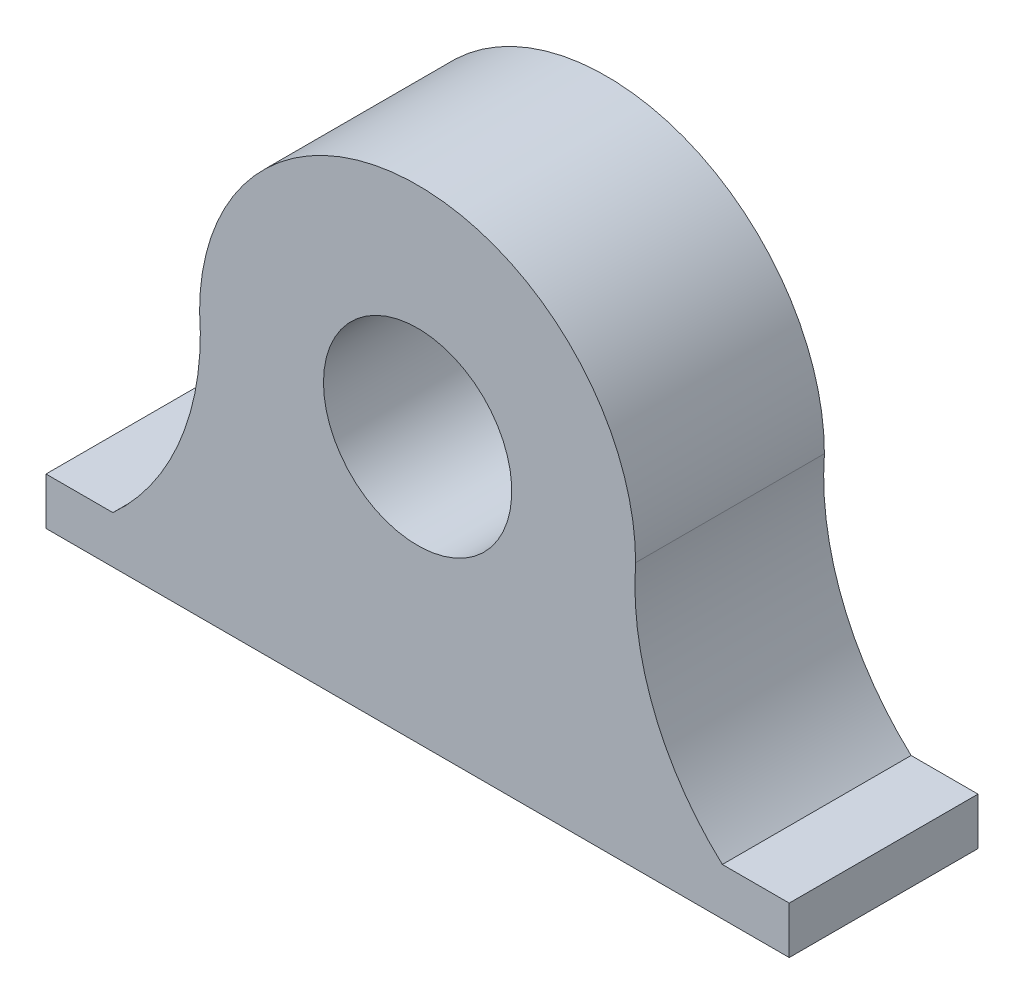
ISO-10303-21;
HEADER;
FILE_DESCRIPTION(('STEP AP214'),'2;1');
FILE_NAME('part.step','',(''),(''),'','','');
FILE_SCHEMA(('AUTOMOTIVE_DESIGN { 1 0 10303 214 1 1 1 1 }'));
ENDSEC;
DATA;
#1=APPLICATION_CONTEXT('core data for automotive mechanical design processes');
#2=APPLICATION_PROTOCOL_DEFINITION('international standard','automotive_design',2000,#1);
#3=PRODUCT_CONTEXT('',#1,'mechanical');
#4=PRODUCT('Part','Part','',(#3));
#5=PRODUCT_RELATED_PRODUCT_CATEGORY('part','',(#4));
#6=PRODUCT_DEFINITION_FORMATION('','',#4);
#7=PRODUCT_DEFINITION_CONTEXT('part definition',#1,'design');
#8=PRODUCT_DEFINITION('design','',#6,#7);
#9=PRODUCT_DEFINITION_SHAPE('','',#8);
#10=(LENGTH_UNIT() NAMED_UNIT(*) SI_UNIT(.MILLI.,.METRE.));
#11=(NAMED_UNIT(*) PLANE_ANGLE_UNIT() SI_UNIT($,.RADIAN.));
#12=(NAMED_UNIT(*) SI_UNIT($,.STERADIAN.) SOLID_ANGLE_UNIT());
#13=UNCERTAINTY_MEASURE_WITH_UNIT(LENGTH_MEASURE(1.E-05),#10,'distance_accuracy_value','');
#14=(GEOMETRIC_REPRESENTATION_CONTEXT(3) GLOBAL_UNCERTAINTY_ASSIGNED_CONTEXT((#13)) GLOBAL_UNIT_ASSIGNED_CONTEXT((#10,
#11,#12)) REPRESENTATION_CONTEXT('',''));
#15=CARTESIAN_POINT('',(0.,0.,0.));
#16=DIRECTION('',(0.,0.,1.));
#17=DIRECTION('',(1.,0.,0.));
#18=AXIS2_PLACEMENT_3D('',#15,#16,#17);
#19=CARTESIAN_POINT('',(0.,-44.0000000000001,38.1));
#20=DIRECTION('',(0.,1.,0.));
#21=DIRECTION('',(-1.,0.,0.));
#22=AXIS2_PLACEMENT_3D('',#19,#20,#21);
#23=PLANE('',#22);
#24=DIRECTION('',(1.,0.,0.));
#25=VECTOR('',#24,1.);
#26=CARTESIAN_POINT('',(0.,-44.0000000000001,0.));
#27=LINE('',#26,#25);
#28=CARTESIAN_POINT('',(61.5034248182107,-44.,0.));
#29=VERTEX_POINT('',#28);
#30=CARTESIAN_POINT('',(75.,-44.,0.));
#31=VERTEX_POINT('',#30);
#32=EDGE_CURVE('E166',#29,#31,#27,.T.);
#33=ORIENTED_EDGE('',*,*,#32,.F.);
#34=DIRECTION('',(0.,0.,-1.));
#35=VECTOR('',#34,1.);
#36=CARTESIAN_POINT('',(61.5034248182107,-44.,38.1));
#37=LINE('',#36,#35);
#38=CARTESIAN_POINT('',(61.5034248182107,-44.,38.1));
#39=VERTEX_POINT('',#38);
#40=EDGE_CURVE('E11',#39,#29,#37,.T.);
#41=ORIENTED_EDGE('',*,*,#40,.F.);
#42=DIRECTION('',(1.,0.,0.));
#43=VECTOR('',#42,1.);
#44=CARTESIAN_POINT('',(0.,-44.0000000000001,38.1));
#45=LINE('',#44,#43);
#46=CARTESIAN_POINT('',(75.,-44.,38.1));
#47=VERTEX_POINT('',#46);
#48=EDGE_CURVE('E236',#39,#47,#45,.T.);
#49=ORIENTED_EDGE('',*,*,#48,.T.);
#50=DIRECTION('',(0.,0.,-1.));
#51=VECTOR('',#50,1.);
#52=CARTESIAN_POINT('',(75.,-44.,38.1));
#53=LINE('',#52,#51);
#54=EDGE_CURVE('E59',#47,#31,#53,.T.);
#55=ORIENTED_EDGE('',*,*,#54,.T.);
#56=EDGE_LOOP('',(#33,#41,#49,#55));
#57=FACE_BOUND('',#56,.T.);
#58=ADVANCED_FACE('F41',(#57),#23,.T.);
#59=CARTESIAN_POINT('',(98.,-4.,38.1));
#60=DIRECTION('',(0.,0.,-1.));
#61=DIRECTION('',(-1.,0.,0.));
#62=AXIS2_PLACEMENT_3D('',#59,#60,#61);
#63=CYLINDRICAL_SURFACE('',#62,54.1479454827235);
#64=CARTESIAN_POINT('',(98.,-4.,0.));
#65=DIRECTION('',(0.,0.,1.));
#66=DIRECTION('',(1.,0.,0.));
#67=AXIS2_PLACEMENT_3D('',#64,#65,#66);
#68=CIRCLE('',#67,54.1479454827235);
#69=CARTESIAN_POINT('',(44.,0.,0.));
#70=VERTEX_POINT('',#69);
#71=EDGE_CURVE('E162',#29,#70,#68,.F.);
#72=ORIENTED_EDGE('',*,*,#71,.T.);
#73=DIRECTION('',(0.,0.,-1.));
#74=VECTOR('',#73,1.);
#75=CARTESIAN_POINT('',(44.,0.,38.1));
#76=LINE('',#75,#74);
#77=CARTESIAN_POINT('',(44.,0.,38.1));
#78=VERTEX_POINT('',#77);
#79=EDGE_CURVE('E51',#78,#70,#76,.T.);
#80=ORIENTED_EDGE('',*,*,#79,.F.);
#81=CARTESIAN_POINT('',(98.,-4.,38.1));
#82=DIRECTION('',(0.,0.,1.));
#83=DIRECTION('',(1.,0.,0.));
#84=AXIS2_PLACEMENT_3D('',#81,#82,#83);
#85=CIRCLE('',#84,54.1479454827235);
#86=EDGE_CURVE('E239',#39,#78,#85,.F.);
#87=ORIENTED_EDGE('',*,*,#86,.F.);
#88=ORIENTED_EDGE('',*,*,#40,.T.);
#89=EDGE_LOOP('',(#72,#80,#87,#88));
#90=FACE_BOUND('',#89,.T.);
#91=ADVANCED_FACE('F163',(#90),#63,.F.);
#92=CARTESIAN_POINT('',(0.,0.,38.1));
#93=DIRECTION('',(0.,0.,-1.));
#94=DIRECTION('',(-1.,0.,0.));
#95=AXIS2_PLACEMENT_3D('',#92,#93,#94);
#96=CYLINDRICAL_SURFACE('',#95,44.);
#97=CARTESIAN_POINT('',(0.,0.,0.));
#98=DIRECTION('',(0.,0.,1.));
#99=DIRECTION('',(1.,0.,0.));
#100=AXIS2_PLACEMENT_3D('',#97,#98,#99);
#101=CIRCLE('',#100,44.);
#102=CARTESIAN_POINT('',(-44.,0.,0.));
#103=VERTEX_POINT('',#102);
#104=EDGE_CURVE('E156',#70,#103,#101,.T.);
#105=ORIENTED_EDGE('',*,*,#104,.T.);
#106=DIRECTION('',(0.,0.,-1.));
#107=VECTOR('',#106,1.);
#108=CARTESIAN_POINT('',(-44.,0.,38.1));
#109=LINE('',#108,#107);
#110=CARTESIAN_POINT('',(-44.,0.,38.1));
#111=VERTEX_POINT('',#110);
#112=EDGE_CURVE('E146',#111,#103,#109,.T.);
#113=ORIENTED_EDGE('',*,*,#112,.F.);
#114=CARTESIAN_POINT('',(0.,0.,38.1));
#115=DIRECTION('',(0.,0.,1.));
#116=DIRECTION('',(1.,0.,0.));
#117=AXIS2_PLACEMENT_3D('',#114,#115,#116);
#118=CIRCLE('',#117,44.);
#119=EDGE_CURVE('E158',#78,#111,#118,.T.);
#120=ORIENTED_EDGE('',*,*,#119,.F.);
#121=ORIENTED_EDGE('',*,*,#79,.T.);
#122=EDGE_LOOP('',(#105,#113,#120,#121));
#123=FACE_BOUND('',#122,.T.);
#124=ADVANCED_FACE('F154',(#123),#96,.T.);
#125=CARTESIAN_POINT('',(-98.,-4.,38.1));
#126=DIRECTION('',(0.,0.,-1.));
#127=DIRECTION('',(-1.,0.,0.));
#128=AXIS2_PLACEMENT_3D('',#125,#126,#127);
#129=CYLINDRICAL_SURFACE('',#128,54.1479454827235);
#130=CARTESIAN_POINT('',(-98.,-4.,0.));
#131=DIRECTION('',(0.,0.,1.));
#132=DIRECTION('',(1.,0.,0.));
#133=AXIS2_PLACEMENT_3D('',#130,#131,#132);
#134=CIRCLE('',#133,54.1479454827235);
#135=CARTESIAN_POINT('',(-61.5034248182107,-44.,0.));
#136=VERTEX_POINT('',#135);
#137=EDGE_CURVE('E170',#136,#103,#134,.T.);
#138=ORIENTED_EDGE('',*,*,#137,.F.);
#139=DIRECTION('',(0.,0.,-1.));
#140=VECTOR('',#139,1.);
#141=CARTESIAN_POINT('',(-61.5034248182107,-44.,38.1));
#142=LINE('',#141,#140);
#143=CARTESIAN_POINT('',(-61.5034248182107,-44.,38.1));
#144=VERTEX_POINT('',#143);
#145=EDGE_CURVE('E139',#144,#136,#142,.T.);
#146=ORIENTED_EDGE('',*,*,#145,.F.);
#147=CARTESIAN_POINT('',(-98.,-4.,38.1));
#148=DIRECTION('',(0.,0.,1.));
#149=DIRECTION('',(1.,0.,0.));
#150=AXIS2_PLACEMENT_3D('',#147,#148,#149);
#151=CIRCLE('',#150,54.1479454827235);
#152=EDGE_CURVE('E246',#144,#111,#151,.T.);
#153=ORIENTED_EDGE('',*,*,#152,.T.);
#154=ORIENTED_EDGE('',*,*,#112,.T.);
#155=EDGE_LOOP('',(#138,#146,#153,#154));
#156=FACE_BOUND('',#155,.T.);
#157=ADVANCED_FACE('F218',(#156),#129,.F.);
#158=CARTESIAN_POINT('',(0.,-44.,38.1));
#159=DIRECTION('',(0.,1.,0.));
#160=DIRECTION('',(-1.,0.,0.));
#161=AXIS2_PLACEMENT_3D('',#158,#159,#160);
#162=PLANE('',#161);
#163=DIRECTION('',(1.,0.,0.));
#164=VECTOR('',#163,1.);
#165=CARTESIAN_POINT('',(0.,-44.,0.));
#166=LINE('',#165,#164);
#167=CARTESIAN_POINT('',(-75.,-44.,0.));
#168=VERTEX_POINT('',#167);
#169=EDGE_CURVE('E178',#168,#136,#166,.T.);
#170=ORIENTED_EDGE('',*,*,#169,.F.);
#171=DIRECTION('',(0.,0.,-1.));
#172=VECTOR('',#171,1.);
#173=CARTESIAN_POINT('',(-75.,-44.,38.1));
#174=LINE('',#173,#172);
#175=CARTESIAN_POINT('',(-75.,-44.,38.1));
#176=VERTEX_POINT('',#175);
#177=EDGE_CURVE('E135',#176,#168,#174,.T.);
#178=ORIENTED_EDGE('',*,*,#177,.F.);
#179=DIRECTION('',(1.,0.,0.));
#180=VECTOR('',#179,1.);
#181=CARTESIAN_POINT('',(0.,-44.,38.1));
#182=LINE('',#181,#180);
#183=EDGE_CURVE('E127',#176,#144,#182,.T.);
#184=ORIENTED_EDGE('',*,*,#183,.T.);
#185=ORIENTED_EDGE('',*,*,#145,.T.);
#186=EDGE_LOOP('',(#170,#178,#184,#185));
#187=FACE_BOUND('',#186,.T.);
#188=ADVANCED_FACE('F221',(#187),#162,.T.);
#189=CARTESIAN_POINT('',(-74.9999999999999,1.09273919746571E-13,38.1));
#190=DIRECTION('',(1.,0.,0.));
#191=DIRECTION('',(0.,1.,0.));
#192=AXIS2_PLACEMENT_3D('',#189,#190,#191);
#193=PLANE('',#192);
#194=DIRECTION('',(0.,-1.,0.));
#195=VECTOR('',#194,1.);
#196=CARTESIAN_POINT('',(-74.9999999999999,1.09273919746571E-13,0.));
#197=LINE('',#196,#195);
#198=CARTESIAN_POINT('',(-75.,-53.525,0.));
#199=VERTEX_POINT('',#198);
#200=EDGE_CURVE('E133',#168,#199,#197,.T.);
#201=ORIENTED_EDGE('',*,*,#200,.T.);
#202=DIRECTION('',(0.,0.,-1.));
#203=VECTOR('',#202,1.);
#204=CARTESIAN_POINT('',(-75.,-53.525,38.1));
#205=LINE('',#204,#203);
#206=CARTESIAN_POINT('',(-75.,-53.525,38.1));
#207=VERTEX_POINT('',#206);
#208=EDGE_CURVE('E113',#207,#199,#205,.T.);
#209=ORIENTED_EDGE('',*,*,#208,.F.);
#210=DIRECTION('',(0.,-1.,0.));
#211=VECTOR('',#210,1.);
#212=CARTESIAN_POINT('',(-74.9999999999999,1.09273919746571E-13,38.1));
#213=LINE('',#212,#211);
#214=EDGE_CURVE('E119',#176,#207,#213,.T.);
#215=ORIENTED_EDGE('',*,*,#214,.F.);
#216=ORIENTED_EDGE('',*,*,#177,.T.);
#217=EDGE_LOOP('',(#201,#209,#215,#216));
#218=FACE_BOUND('',#217,.T.);
#219=ADVANCED_FACE('F131',(#218),#193,.F.);
#220=CARTESIAN_POINT('',(0.,-53.525,38.1));
#221=DIRECTION('',(0.,1.,0.));
#222=DIRECTION('',(-1.,0.,0.));
#223=AXIS2_PLACEMENT_3D('',#220,#221,#222);
#224=PLANE('',#223);
#225=DIRECTION('',(1.,0.,0.));
#226=VECTOR('',#225,1.);
#227=CARTESIAN_POINT('',(0.,-53.525,0.));
#228=LINE('',#227,#226);
#229=CARTESIAN_POINT('',(75.,-53.525,0.));
#230=VERTEX_POINT('',#229);
#231=EDGE_CURVE('E184',#199,#230,#228,.T.);
#232=ORIENTED_EDGE('',*,*,#231,.T.);
#233=DIRECTION('',(0.,0.,-1.));
#234=VECTOR('',#233,1.);
#235=CARTESIAN_POINT('',(75.,-53.525,38.1));
#236=LINE('',#235,#234);
#237=CARTESIAN_POINT('',(75.,-53.525,38.1));
#238=VERTEX_POINT('',#237);
#239=EDGE_CURVE('E85',#238,#230,#236,.T.);
#240=ORIENTED_EDGE('',*,*,#239,.F.);
#241=DIRECTION('',(1.,0.,0.));
#242=VECTOR('',#241,1.);
#243=CARTESIAN_POINT('',(0.,-53.525,38.1));
#244=LINE('',#243,#242);
#245=EDGE_CURVE('E109',#207,#238,#244,.T.);
#246=ORIENTED_EDGE('',*,*,#245,.F.);
#247=ORIENTED_EDGE('',*,*,#208,.T.);
#248=EDGE_LOOP('',(#232,#240,#246,#247));
#249=FACE_BOUND('',#248,.T.);
#250=ADVANCED_FACE('F111',(#249),#224,.F.);
#251=CARTESIAN_POINT('',(0.,0.,38.1));
#252=DIRECTION('',(0.,0.,-1.));
#253=DIRECTION('',(-1.,0.,0.));
#254=AXIS2_PLACEMENT_3D('',#251,#252,#253);
#255=CYLINDRICAL_SURFACE('',#254,19.);
#256=CARTESIAN_POINT('',(0.,0.,38.1));
#257=DIRECTION('',(0.,0.,1.));
#258=DIRECTION('',(1.,0.,0.));
#259=AXIS2_PLACEMENT_3D('',#256,#257,#258);
#260=CIRCLE('',#259,19.);
#261=CARTESIAN_POINT('',(-19.,0.,38.1));
#262=VERTEX_POINT('',#261);
#263=EDGE_CURVE('E190',#262,#262,#260,.T.);
#264=CARTESIAN_POINT('',(0.,0.,0.));
#265=DIRECTION('',(0.,0.,1.));
#266=DIRECTION('',(1.,0.,0.));
#267=AXIS2_PLACEMENT_3D('',#264,#265,#266);
#268=CIRCLE('',#267,19.);
#269=CARTESIAN_POINT('',(-19.,0.,0.));
#270=VERTEX_POINT('',#269);
#271=EDGE_CURVE('E172',#270,#270,#268,.T.);
#272=CARTESIAN_POINT('',(-19.,0.,38.1));
#273=CARTESIAN_POINT('',(-19.,0.,37.703125));
#274=CARTESIAN_POINT('',(-19.,0.,37.30625));
#275=CARTESIAN_POINT('',(-19.,0.,36.5125));
#276=CARTESIAN_POINT('',(-19.,0.,36.115625));
#277=CARTESIAN_POINT('',(-19.,0.,35.321875));
#278=CARTESIAN_POINT('',(-19.,0.,34.925));
#279=CARTESIAN_POINT('',(-19.,0.,34.13125));
#280=CARTESIAN_POINT('',(-19.,0.,33.734375));
#281=CARTESIAN_POINT('',(-19.,0.,32.940625));
#282=CARTESIAN_POINT('',(-19.,0.,32.54375));
#283=CARTESIAN_POINT('',(-19.,0.,31.75));
#284=CARTESIAN_POINT('',(-19.,0.,31.353125));
#285=CARTESIAN_POINT('',(-19.,0.,30.559375));
#286=CARTESIAN_POINT('',(-19.,0.,30.1625));
#287=CARTESIAN_POINT('',(-19.,0.,29.36875));
#288=CARTESIAN_POINT('',(-19.,0.,28.971875));
#289=CARTESIAN_POINT('',(-19.,0.,28.178125));
#290=CARTESIAN_POINT('',(-19.,0.,27.78125));
#291=CARTESIAN_POINT('',(-19.,0.,26.9875));
#292=CARTESIAN_POINT('',(-19.,0.,26.590625));
#293=CARTESIAN_POINT('',(-19.,0.,25.796875));
#294=CARTESIAN_POINT('',(-19.,0.,25.4));
#295=CARTESIAN_POINT('',(-19.,0.,24.60625));
#296=CARTESIAN_POINT('',(-19.,0.,24.209375));
#297=CARTESIAN_POINT('',(-19.,0.,23.415625));
#298=CARTESIAN_POINT('',(-19.,0.,23.01875));
#299=CARTESIAN_POINT('',(-19.,0.,22.225));
#300=CARTESIAN_POINT('',(-19.,0.,21.828125));
#301=CARTESIAN_POINT('',(-19.,0.,21.034375));
#302=CARTESIAN_POINT('',(-19.,0.,20.6375));
#303=CARTESIAN_POINT('',(-19.,0.,19.84375));
#304=CARTESIAN_POINT('',(-19.,0.,19.446875));
#305=CARTESIAN_POINT('',(-19.,0.,18.653125));
#306=CARTESIAN_POINT('',(-19.,0.,18.25625));
#307=CARTESIAN_POINT('',(-19.,0.,17.4625));
#308=CARTESIAN_POINT('',(-19.,0.,17.065625));
#309=CARTESIAN_POINT('',(-19.,0.,16.271875));
#310=CARTESIAN_POINT('',(-19.,0.,15.875));
#311=CARTESIAN_POINT('',(-19.,0.,15.08125));
#312=CARTESIAN_POINT('',(-19.,0.,14.684375));
#313=CARTESIAN_POINT('',(-19.,0.,13.890625));
#314=CARTESIAN_POINT('',(-19.,0.,13.49375));
#315=CARTESIAN_POINT('',(-19.,0.,12.7));
#316=CARTESIAN_POINT('',(-19.,0.,12.303125));
#317=CARTESIAN_POINT('',(-19.,0.,11.509375));
#318=CARTESIAN_POINT('',(-19.,0.,11.1125));
#319=CARTESIAN_POINT('',(-19.,0.,10.31875));
#320=CARTESIAN_POINT('',(-19.,0.,9.92187499999999));
#321=CARTESIAN_POINT('',(-19.,0.,9.128125));
#322=CARTESIAN_POINT('',(-19.,0.,8.73124999999999));
#323=CARTESIAN_POINT('',(-19.,0.,7.93749999999999));
#324=CARTESIAN_POINT('',(-19.,0.,7.54062499999999));
#325=CARTESIAN_POINT('',(-19.,0.,6.746875));
#326=CARTESIAN_POINT('',(-19.,0.,6.35));
#327=CARTESIAN_POINT('',(-19.,0.,5.55625));
#328=CARTESIAN_POINT('',(-19.,0.,5.159375));
#329=CARTESIAN_POINT('',(-19.,0.,4.365625));
#330=CARTESIAN_POINT('',(-19.,0.,3.96875));
#331=CARTESIAN_POINT('',(-19.,0.,3.175));
#332=CARTESIAN_POINT('',(-19.,0.,2.778125));
#333=CARTESIAN_POINT('',(-19.,0.,1.984375));
#334=CARTESIAN_POINT('',(-19.,0.,1.5875));
#335=CARTESIAN_POINT('',(-19.,0.,0.79375));
#336=CARTESIAN_POINT('',(-19.,0.,0.396875));
#337=CARTESIAN_POINT('',(-19.,0.,0.));
#338=B_SPLINE_CURVE_WITH_KNOTS('',3,(#272,#273,#274,#275,#276,#277,#278,#279,#280,#281,#282,
#283,#284,#285,#286,#287,#288,#289,#290,#291,#292,#293,#294,#295,#296,#297,#298,#299,#300,#301,
#302,#303,#304,#305,#306,#307,#308,#309,#310,#311,#312,#313,#314,#315,#316,#317,#318,#319,#320,
#321,#322,#323,#324,#325,#326,#327,#328,#329,#330,#331,#332,#333,#334,#335,#336,#337),
.UNSPECIFIED.,.F.,.F.,(4,2,2,2,2,2,2,2,2,2,2,2,2,2,2,2,2,2,2,2,2,2,2,2,2,2,2,2,2,2,2,2,4),(0.,
1.190625,2.38125,3.571875,4.7625,5.953125,7.14375,8.334375,9.52500000000001,10.715625,11.90625,
13.096875,14.2875,15.478125,16.66875,17.859375,19.05,20.240625,21.43125,22.621875,23.8125,
25.003125,26.19375,27.384375,28.575,29.765625,30.95625,32.146875,33.3375,34.528125,35.71875,
36.909375,38.1),.UNSPECIFIED.);
#339=EDGE_CURVE('BSEAM43',#262,#270,#338,.T.);
#340=ORIENTED_EDGE('',*,*,#263,.T.);
#341=ORIENTED_EDGE('',*,*,#271,.F.);
#342=ORIENTED_EDGE('',*,*,#339,.T.);
#343=ORIENTED_EDGE('',*,*,#339,.F.);
#344=EDGE_LOOP('',(#340,#342,#341,#343));
#345=FACE_BOUND('',#344,.T.);
#346=ADVANCED_FACE('F43',(#345),#255,.F.);
#347=CARTESIAN_POINT('',(75.0000000000001,-1.09273919746571E-13,38.1));
#348=DIRECTION('',(1.,0.,0.));
#349=DIRECTION('',(0.,1.,0.));
#350=AXIS2_PLACEMENT_3D('',#347,#348,#349);
#351=PLANE('',#350);
#352=DIRECTION('',(0.,-1.,0.));
#353=VECTOR('',#352,1.);
#354=CARTESIAN_POINT('',(75.0000000000001,-1.09273919746571E-13,0.));
#355=LINE('',#354,#353);
#356=EDGE_CURVE('E187',#31,#230,#355,.T.);
#357=ORIENTED_EDGE('',*,*,#356,.F.);
#358=ORIENTED_EDGE('',*,*,#54,.F.);
#359=DIRECTION('',(0.,-1.,0.));
#360=VECTOR('',#359,1.);
#361=CARTESIAN_POINT('',(75.0000000000001,-1.09273919746571E-13,38.1));
#362=LINE('',#361,#360);
#363=EDGE_CURVE('E118',#47,#238,#362,.T.);
#364=ORIENTED_EDGE('',*,*,#363,.T.);
#365=ORIENTED_EDGE('',*,*,#239,.T.);
#366=EDGE_LOOP('',(#357,#358,#364,#365));
#367=FACE_BOUND('',#366,.T.);
#368=ADVANCED_FACE('F201',(#367),#351,.T.);
#369=CARTESIAN_POINT('',(0.,0.,38.1));
#370=DIRECTION('',(0.,0.,1.));
#371=DIRECTION('',(1.,0.,0.));
#372=AXIS2_PLACEMENT_3D('',#369,#370,#371);
#373=PLANE('',#372);
#374=ORIENTED_EDGE('',*,*,#263,.F.);
#375=EDGE_LOOP('',(#374));
#376=FACE_BOUND('',#375,.T.);
#377=ORIENTED_EDGE('',*,*,#48,.F.);
#378=ORIENTED_EDGE('',*,*,#86,.T.);
#379=ORIENTED_EDGE('',*,*,#119,.T.);
#380=ORIENTED_EDGE('',*,*,#152,.F.);
#381=ORIENTED_EDGE('',*,*,#183,.F.);
#382=ORIENTED_EDGE('',*,*,#214,.T.);
#383=ORIENTED_EDGE('',*,*,#245,.T.);
#384=ORIENTED_EDGE('',*,*,#363,.F.);
#385=EDGE_LOOP('',(#377,#378,#379,#380,#381,#382,#383,#384));
#386=FACE_BOUND('',#385,.T.);
#387=ADVANCED_FACE('F124',(#376,#386),#373,.T.);
#388=CARTESIAN_POINT('',(0.,0.,0.));
#389=DIRECTION('',(0.,0.,1.));
#390=DIRECTION('',(1.,0.,0.));
#391=AXIS2_PLACEMENT_3D('',#388,#389,#390);
#392=PLANE('',#391);
#393=ORIENTED_EDGE('',*,*,#271,.T.);
#394=EDGE_LOOP('',(#393));
#395=FACE_BOUND('',#394,.T.);
#396=ORIENTED_EDGE('',*,*,#32,.T.);
#397=ORIENTED_EDGE('',*,*,#356,.T.);
#398=ORIENTED_EDGE('',*,*,#231,.F.);
#399=ORIENTED_EDGE('',*,*,#200,.F.);
#400=ORIENTED_EDGE('',*,*,#169,.T.);
#401=ORIENTED_EDGE('',*,*,#137,.T.);
#402=ORIENTED_EDGE('',*,*,#104,.F.);
#403=ORIENTED_EDGE('',*,*,#71,.F.);
#404=EDGE_LOOP('',(#396,#397,#398,#399,#400,#401,#402,#403));
#405=FACE_BOUND('',#404,.T.);
#406=ADVANCED_FACE('F198',(#395,#405),#392,.F.);
#407=CLOSED_SHELL('',(#58,#91,#124,#157,#188,#219,#250,#346,#368,#387,#406));
#408=MANIFOLD_SOLID_BREP('B2',#407);
#409=ADVANCED_BREP_SHAPE_REPRESENTATION('',(#18,#408),#14);
#410=SHAPE_DEFINITION_REPRESENTATION(#9,#409);
ENDSEC;
END-ISO-10303-21;
